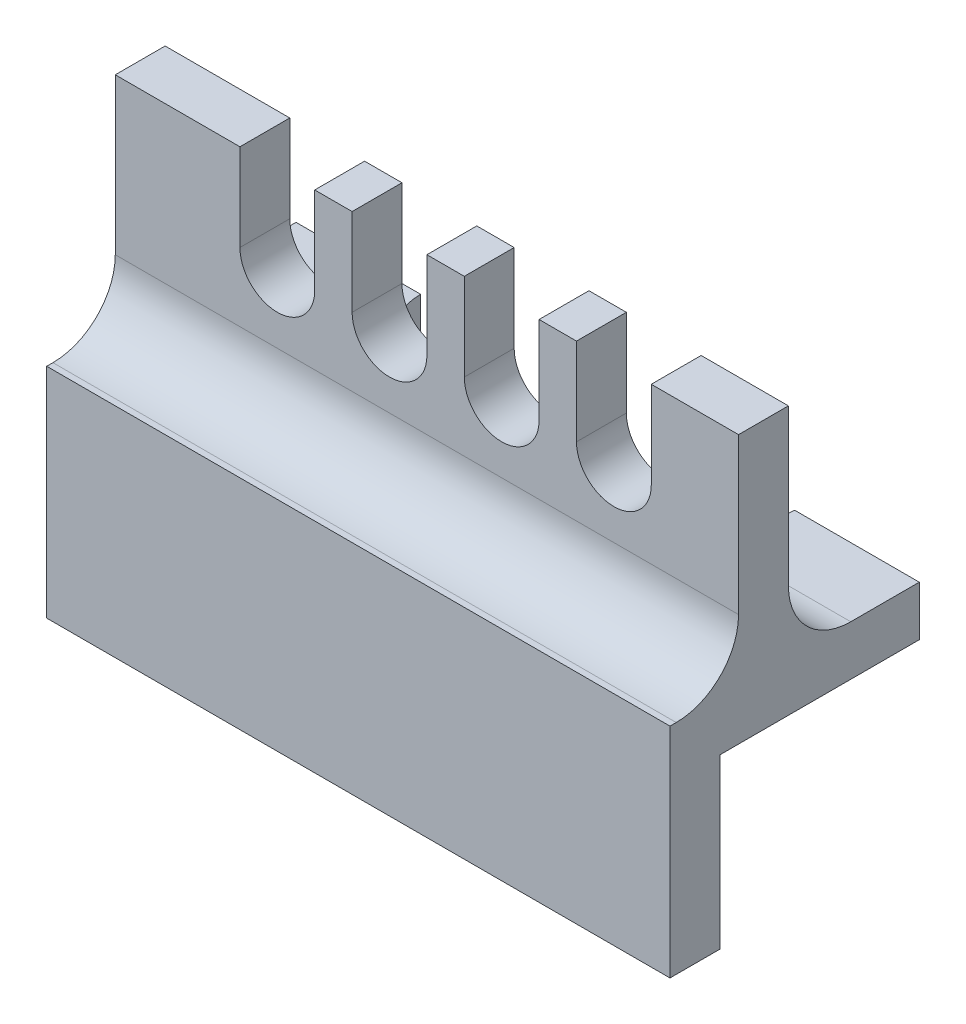
ISO-10303-21;
HEADER;
FILE_DESCRIPTION(('STEP AP214'),'2;1');
FILE_NAME('part.step','',(''),(''),'','','');
FILE_SCHEMA(('AUTOMOTIVE_DESIGN { 1 0 10303 214 1 1 1 1 }'));
ENDSEC;
DATA;
#1=APPLICATION_CONTEXT('core data for automotive mechanical design processes');
#2=APPLICATION_PROTOCOL_DEFINITION('international standard','automotive_design',2000,#1);
#3=PRODUCT_CONTEXT('',#1,'mechanical');
#4=PRODUCT('Part','Part','',(#3));
#5=PRODUCT_RELATED_PRODUCT_CATEGORY('part','',(#4));
#6=PRODUCT_DEFINITION_FORMATION('','',#4);
#7=PRODUCT_DEFINITION_CONTEXT('part definition',#1,'design');
#8=PRODUCT_DEFINITION('design','',#6,#7);
#9=PRODUCT_DEFINITION_SHAPE('','',#8);
#10=(LENGTH_UNIT() NAMED_UNIT(*) SI_UNIT(.MILLI.,.METRE.));
#11=(NAMED_UNIT(*) PLANE_ANGLE_UNIT() SI_UNIT($,.RADIAN.));
#12=(NAMED_UNIT(*) SI_UNIT($,.STERADIAN.) SOLID_ANGLE_UNIT());
#13=UNCERTAINTY_MEASURE_WITH_UNIT(LENGTH_MEASURE(1.E-05),#10,'distance_accuracy_value','');
#14=(GEOMETRIC_REPRESENTATION_CONTEXT(3) GLOBAL_UNCERTAINTY_ASSIGNED_CONTEXT((#13)) GLOBAL_UNIT_ASSIGNED_CONTEXT((#10,
#11,#12)) REPRESENTATION_CONTEXT('',''));
#15=CARTESIAN_POINT('',(0.,0.,0.));
#16=DIRECTION('',(0.,0.,1.));
#17=DIRECTION('',(1.,0.,0.));
#18=AXIS2_PLACEMENT_3D('',#15,#16,#17);
#19=CARTESIAN_POINT('',(-100.,70.,-11.));
#20=DIRECTION('',(0.,1.,0.));
#21=DIRECTION('',(0.,0.,1.));
#22=AXIS2_PLACEMENT_3D('',#19,#20,#21);
#23=PLANE('',#22);
#24=DIRECTION('',(0.,0.,-1.));
#25=VECTOR('',#24,1.);
#26=CARTESIAN_POINT('',(-26.,70.,-8.99999999999999));
#27=LINE('',#26,#25);
#28=CARTESIAN_POINT('',(-26.,70.,-11.));
#29=VERTEX_POINT('',#28);
#30=CARTESIAN_POINT('',(-26.,70.,-19.));
#31=VERTEX_POINT('',#30);
#32=EDGE_CURVE('E285',#29,#31,#27,.T.);
#33=ORIENTED_EDGE('',*,*,#32,.T.);
#34=DIRECTION('',(1.,0.,0.));
#35=VECTOR('',#34,1.);
#36=CARTESIAN_POINT('',(-100.,70.,-19.));
#37=LINE('',#36,#35);
#38=CARTESIAN_POINT('',(-32.,70.,-19.));
#39=VERTEX_POINT('',#38);
#40=EDGE_CURVE('E568',#39,#31,#37,.T.);
#41=ORIENTED_EDGE('',*,*,#40,.F.);
#42=DIRECTION('',(0.,0.,-1.));
#43=VECTOR('',#42,1.);
#44=CARTESIAN_POINT('',(-32.,70.,-8.99999999999999));
#45=LINE('',#44,#43);
#46=CARTESIAN_POINT('',(-32.,70.,-11.));
#47=VERTEX_POINT('',#46);
#48=EDGE_CURVE('E62',#47,#39,#45,.T.);
#49=ORIENTED_EDGE('',*,*,#48,.F.);
#50=DIRECTION('',(1.,0.,0.));
#51=VECTOR('',#50,1.);
#52=CARTESIAN_POINT('',(-100.,70.,-11.));
#53=LINE('',#52,#51);
#54=EDGE_CURVE('E533',#47,#29,#53,.T.);
#55=ORIENTED_EDGE('',*,*,#54,.T.);
#56=EDGE_LOOP('',(#33,#41,#49,#55));
#57=FACE_BOUND('',#56,.T.);
#58=ADVANCED_FACE('F39',(#57),#23,.T.);
#59=DIRECTION('',(0.,0.,-1.));
#60=VECTOR('',#59,1.);
#61=CARTESIAN_POINT('',(-62.,70.,-8.99999999999999));
#62=LINE('',#61,#60);
#63=CARTESIAN_POINT('',(-62.,70.,-11.));
#64=VERTEX_POINT('',#63);
#65=CARTESIAN_POINT('',(-62.,70.,-19.));
#66=VERTEX_POINT('',#65);
#67=EDGE_CURVE('E300',#64,#66,#62,.T.);
#68=ORIENTED_EDGE('',*,*,#67,.T.);
#69=CARTESIAN_POINT('',(-68.,70.,-19.));
#70=VERTEX_POINT('',#69);
#71=EDGE_CURVE('E432',#70,#66,#37,.T.);
#72=ORIENTED_EDGE('',*,*,#71,.F.);
#73=DIRECTION('',(0.,0.,-1.));
#74=VECTOR('',#73,1.);
#75=CARTESIAN_POINT('',(-68.,70.,-8.99999999999999));
#76=LINE('',#75,#74);
#77=CARTESIAN_POINT('',(-68.,70.,-11.));
#78=VERTEX_POINT('',#77);
#79=EDGE_CURVE('E320',#78,#70,#76,.T.);
#80=ORIENTED_EDGE('',*,*,#79,.F.);
#81=EDGE_CURVE('E427',#78,#64,#53,.T.);
#82=ORIENTED_EDGE('',*,*,#81,.T.);
#83=EDGE_LOOP('',(#68,#72,#80,#82));
#84=FACE_BOUND('',#83,.T.);
#85=ADVANCED_FACE('F546',(#84),#23,.T.);
#86=DIRECTION('',(0.,0.,-1.));
#87=VECTOR('',#86,1.);
#88=CARTESIAN_POINT('',(-50.,70.,-8.99999999999999));
#89=LINE('',#88,#87);
#90=CARTESIAN_POINT('',(-50.,70.,-11.));
#91=VERTEX_POINT('',#90);
#92=CARTESIAN_POINT('',(-50.,70.,-19.));
#93=VERTEX_POINT('',#92);
#94=EDGE_CURVE('E291',#91,#93,#89,.T.);
#95=ORIENTED_EDGE('',*,*,#94,.F.);
#96=CARTESIAN_POINT('',(-44.,70.,-11.));
#97=VERTEX_POINT('',#96);
#98=EDGE_CURVE('E535',#91,#97,#53,.T.);
#99=ORIENTED_EDGE('',*,*,#98,.T.);
#100=DIRECTION('',(0.,0.,-1.));
#101=VECTOR('',#100,1.);
#102=CARTESIAN_POINT('',(-44.,70.,-8.99999999999999));
#103=LINE('',#102,#101);
#104=CARTESIAN_POINT('',(-44.,70.,-19.));
#105=VERTEX_POINT('',#104);
#106=EDGE_CURVE('E314',#97,#105,#103,.T.);
#107=ORIENTED_EDGE('',*,*,#106,.T.);
#108=EDGE_CURVE('E567',#93,#105,#37,.T.);
#109=ORIENTED_EDGE('',*,*,#108,.F.);
#110=EDGE_LOOP('',(#95,#99,#107,#109));
#111=FACE_BOUND('',#110,.T.);
#112=ADVANCED_FACE('F608',(#111),#23,.T.);
#113=DIRECTION('',(0.,0.,-1.));
#114=VECTOR('',#113,1.);
#115=CARTESIAN_POINT('',(-80.,70.,-8.99999999999999));
#116=LINE('',#115,#114);
#117=CARTESIAN_POINT('',(-80.,70.,-11.));
#118=VERTEX_POINT('',#117);
#119=CARTESIAN_POINT('',(-80.,70.,-19.));
#120=VERTEX_POINT('',#119);
#121=EDGE_CURVE('E282',#118,#120,#116,.T.);
#122=ORIENTED_EDGE('',*,*,#121,.T.);
#123=CARTESIAN_POINT('',(-100.,70.,-19.));
#124=VERTEX_POINT('',#123);
#125=EDGE_CURVE('E429',#124,#120,#37,.T.);
#126=ORIENTED_EDGE('',*,*,#125,.F.);
#127=DIRECTION('',(0.,0.,1.));
#128=VECTOR('',#127,1.);
#129=CARTESIAN_POINT('',(-100.,70.,-11.));
#130=LINE('',#129,#128);
#131=CARTESIAN_POINT('',(-100.,70.,-11.));
#132=VERTEX_POINT('',#131);
#133=EDGE_CURVE('E379',#124,#132,#130,.T.);
#134=ORIENTED_EDGE('',*,*,#133,.T.);
#135=EDGE_CURVE('E424',#132,#118,#53,.T.);
#136=ORIENTED_EDGE('',*,*,#135,.T.);
#137=EDGE_LOOP('',(#122,#126,#134,#136));
#138=FACE_BOUND('',#137,.T.);
#139=ADVANCED_FACE('F581',(#138),#23,.T.);
#140=CARTESIAN_POINT('',(-100.,35.,-40.));
#141=DIRECTION('',(0.,0.,-1.));
#142=DIRECTION('',(0.,1.,0.));
#143=AXIS2_PLACEMENT_3D('',#140,#141,#142);
#144=PLANE('',#143);
#145=DIRECTION('',(0.,-1.,0.));
#146=VECTOR('',#145,1.);
#147=CARTESIAN_POINT('',(-20.,27.,-40.));
#148=LINE('',#147,#146);
#149=CARTESIAN_POINT('',(-20.,35.,-40.));
#150=VERTEX_POINT('',#149);
#151=CARTESIAN_POINT('',(-20.,27.,-40.));
#152=VERTEX_POINT('',#151);
#153=EDGE_CURVE('E348',#150,#152,#148,.T.);
#154=ORIENTED_EDGE('',*,*,#153,.F.);
#155=DIRECTION('',(1.,0.,0.));
#156=VECTOR('',#155,1.);
#157=CARTESIAN_POINT('',(-100.,35.,-40.));
#158=LINE('',#157,#156);
#159=CARTESIAN_POINT('',(0.,35.,-40.));
#160=VERTEX_POINT('',#159);
#161=EDGE_CURVE('E437',#150,#160,#158,.T.);
#162=ORIENTED_EDGE('',*,*,#161,.T.);
#163=DIRECTION('',(0.,1.,0.));
#164=VECTOR('',#163,1.);
#165=CARTESIAN_POINT('',(0.,35.,-40.));
#166=LINE('',#165,#164);
#167=CARTESIAN_POINT('',(0.,27.,-40.));
#168=VERTEX_POINT('',#167);
#169=EDGE_CURVE('E399',#168,#160,#166,.T.);
#170=ORIENTED_EDGE('',*,*,#169,.F.);
#171=DIRECTION('',(1.,0.,0.));
#172=VECTOR('',#171,1.);
#173=CARTESIAN_POINT('',(-100.,27.,-40.));
#174=LINE('',#173,#172);
#175=EDGE_CURVE('E441',#152,#168,#174,.T.);
#176=ORIENTED_EDGE('',*,*,#175,.F.);
#177=EDGE_LOOP('',(#154,#162,#170,#176));
#178=FACE_BOUND('',#177,.T.);
#179=ADVANCED_FACE('F495',(#178),#144,.T.);
#180=CARTESIAN_POINT('',(-100.,0.,-8.));
#181=DIRECTION('',(0.,-1.,0.));
#182=DIRECTION('',(0.,0.,-1.));
#183=AXIS2_PLACEMENT_3D('',#180,#181,#182);
#184=PLANE('',#183);
#185=DIRECTION('',(0.,0.,-1.));
#186=VECTOR('',#185,1.);
#187=CARTESIAN_POINT('',(0.,0.,-8.));
#188=LINE('',#187,#186);
#189=CARTESIAN_POINT('',(0.,0.,0.));
#190=VERTEX_POINT('',#189);
#191=CARTESIAN_POINT('',(0.,0.,-8.));
#192=VERTEX_POINT('',#191);
#193=EDGE_CURVE('E356',#190,#192,#188,.T.);
#194=ORIENTED_EDGE('',*,*,#193,.F.);
#195=DIRECTION('',(1.,0.,0.));
#196=VECTOR('',#195,1.);
#197=CARTESIAN_POINT('',(-100.,0.,0.));
#198=LINE('',#197,#196);
#199=CARTESIAN_POINT('',(-100.,0.,0.));
#200=VERTEX_POINT('',#199);
#201=EDGE_CURVE('E418',#200,#190,#198,.T.);
#202=ORIENTED_EDGE('',*,*,#201,.F.);
#203=DIRECTION('',(0.,0.,-1.));
#204=VECTOR('',#203,1.);
#205=CARTESIAN_POINT('',(-100.,0.,-8.));
#206=LINE('',#205,#204);
#207=CARTESIAN_POINT('',(-100.,0.,-8.));
#208=VERTEX_POINT('',#207);
#209=EDGE_CURVE('E361',#200,#208,#206,.T.);
#210=ORIENTED_EDGE('',*,*,#209,.T.);
#211=DIRECTION('',(1.,0.,0.));
#212=VECTOR('',#211,1.);
#213=CARTESIAN_POINT('',(-100.,0.,-8.));
#214=LINE('',#213,#212);
#215=EDGE_CURVE('E390',#208,#192,#214,.T.);
#216=ORIENTED_EDGE('',*,*,#215,.T.);
#217=EDGE_LOOP('',(#194,#202,#210,#216));
#218=FACE_BOUND('',#217,.T.);
#219=ADVANCED_FACE('F509',(#218),#184,.T.);
#220=CARTESIAN_POINT('',(-100.,0.,0.));
#221=DIRECTION('',(0.,0.,1.));
#222=DIRECTION('',(1.,0.,0.));
#223=AXIS2_PLACEMENT_3D('',#220,#221,#222);
#224=PLANE('',#223);
#225=DIRECTION('',(0.,-1.,0.));
#226=VECTOR('',#225,1.);
#227=CARTESIAN_POINT('',(0.,0.,0.));
#228=LINE('',#227,#226);
#229=CARTESIAN_POINT('',(0.,35.,0.));
#230=VERTEX_POINT('',#229);
#231=EDGE_CURVE('E365',#230,#190,#228,.T.);
#232=ORIENTED_EDGE('',*,*,#231,.F.);
#233=DIRECTION('',(1.,0.,0.));
#234=VECTOR('',#233,1.);
#235=CARTESIAN_POINT('',(-100.,35.,0.));
#236=LINE('',#235,#234);
#237=CARTESIAN_POINT('',(-100.,35.,0.));
#238=VERTEX_POINT('',#237);
#239=EDGE_CURVE('E421',#238,#230,#236,.T.);
#240=ORIENTED_EDGE('',*,*,#239,.F.);
#241=DIRECTION('',(0.,-1.,0.));
#242=VECTOR('',#241,1.);
#243=CARTESIAN_POINT('',(-100.,0.,0.));
#244=LINE('',#243,#242);
#245=EDGE_CURVE('E387',#238,#200,#244,.T.);
#246=ORIENTED_EDGE('',*,*,#245,.T.);
#247=ORIENTED_EDGE('',*,*,#201,.T.);
#248=EDGE_LOOP('',(#232,#240,#246,#247));
#249=FACE_BOUND('',#248,.T.);
#250=ADVANCED_FACE('F515',(#249),#224,.T.);
#251=CARTESIAN_POINT('',(-100.,35.,0.));
#252=DIRECTION('',(0.,1.,0.));
#253=DIRECTION('',(0.,0.,1.));
#254=AXIS2_PLACEMENT_3D('',#251,#252,#253);
#255=PLANE('',#254);
#256=DIRECTION('',(0.,0.,1.));
#257=VECTOR('',#256,1.);
#258=CARTESIAN_POINT('',(0.,35.,0.));
#259=LINE('',#258,#257);
#260=CARTESIAN_POINT('',(0.,35.,-0.999999999999992));
#261=VERTEX_POINT('',#260);
#262=EDGE_CURVE('E414',#261,#230,#259,.T.);
#263=ORIENTED_EDGE('',*,*,#262,.F.);
#264=DIRECTION('',(1.,0.,0.));
#265=VECTOR('',#264,1.);
#266=CARTESIAN_POINT('',(-100.,35.,-0.999999999999992));
#267=LINE('',#266,#265);
#268=CARTESIAN_POINT('',(-100.,35.,-0.999999999999992));
#269=VERTEX_POINT('',#268);
#270=EDGE_CURVE('E447',#261,#269,#267,.F.);
#271=ORIENTED_EDGE('',*,*,#270,.T.);
#272=DIRECTION('',(0.,0.,1.));
#273=VECTOR('',#272,1.);
#274=CARTESIAN_POINT('',(-100.,35.,0.));
#275=LINE('',#274,#273);
#276=EDGE_CURVE('E385',#269,#238,#275,.T.);
#277=ORIENTED_EDGE('',*,*,#276,.T.);
#278=ORIENTED_EDGE('',*,*,#239,.T.);
#279=EDGE_LOOP('',(#263,#271,#277,#278));
#280=FACE_BOUND('',#279,.T.);
#281=ADVANCED_FACE('F518',(#280),#255,.T.);
#282=CARTESIAN_POINT('',(-100.,35.,-11.));
#283=DIRECTION('',(0.,0.,1.));
#284=DIRECTION('',(1.,0.,0.));
#285=AXIS2_PLACEMENT_3D('',#282,#283,#284);
#286=PLANE('',#285);
#287=CARTESIAN_POINT('',(-20.,56.,-11.));
#288=DIRECTION('',(0.,0.,1.));
#289=DIRECTION('',(1.,0.,0.));
#290=AXIS2_PLACEMENT_3D('',#287,#288,#289);
#291=CIRCLE('',#290,6.);
#292=CARTESIAN_POINT('',(-26.,56.,-11.));
#293=VERTEX_POINT('',#292);
#294=CARTESIAN_POINT('',(-14.,56.,-11.));
#295=VERTEX_POINT('',#294);
#296=EDGE_CURVE('E262',#293,#295,#291,.T.);
#297=ORIENTED_EDGE('',*,*,#296,.F.);
#298=DIRECTION('',(0.,-1.,0.));
#299=VECTOR('',#298,1.);
#300=CARTESIAN_POINT('',(-26.,35.,-11.));
#301=LINE('',#300,#299);
#302=EDGE_CURVE('E346',#29,#293,#301,.T.);
#303=ORIENTED_EDGE('',*,*,#302,.F.);
#304=ORIENTED_EDGE('',*,*,#54,.F.);
#305=DIRECTION('',(0.,1.,0.));
#306=VECTOR('',#305,1.);
#307=CARTESIAN_POINT('',(-32.,35.,-11.));
#308=LINE('',#307,#306);
#309=CARTESIAN_POINT('',(-32.,56.,-11.));
#310=VERTEX_POINT('',#309);
#311=EDGE_CURVE('E336',#310,#47,#308,.T.);
#312=ORIENTED_EDGE('',*,*,#311,.F.);
#313=CARTESIAN_POINT('',(-38.,56.,-11.));
#314=DIRECTION('',(0.,0.,1.));
#315=DIRECTION('',(1.,0.,0.));
#316=AXIS2_PLACEMENT_3D('',#313,#314,#315);
#317=CIRCLE('',#316,6.);
#318=CARTESIAN_POINT('',(-44.,56.,-11.));
#319=VERTEX_POINT('',#318);
#320=EDGE_CURVE('E279',#319,#310,#317,.T.);
#321=ORIENTED_EDGE('',*,*,#320,.F.);
#322=DIRECTION('',(0.,-1.,0.));
#323=VECTOR('',#322,1.);
#324=CARTESIAN_POINT('',(-44.,35.,-11.));
#325=LINE('',#324,#323);
#326=EDGE_CURVE('E338',#97,#319,#325,.T.);
#327=ORIENTED_EDGE('',*,*,#326,.F.);
#328=ORIENTED_EDGE('',*,*,#98,.F.);
#329=DIRECTION('',(0.,1.,0.));
#330=VECTOR('',#329,1.);
#331=CARTESIAN_POINT('',(-50.,35.,-11.));
#332=LINE('',#331,#330);
#333=CARTESIAN_POINT('',(-50.,56.,-11.));
#334=VERTEX_POINT('',#333);
#335=EDGE_CURVE('E340',#334,#91,#332,.T.);
#336=ORIENTED_EDGE('',*,*,#335,.F.);
#337=CARTESIAN_POINT('',(-56.,56.,-11.));
#338=DIRECTION('',(0.,0.,1.));
#339=DIRECTION('',(1.,0.,0.));
#340=AXIS2_PLACEMENT_3D('',#337,#338,#339);
#341=CIRCLE('',#340,6.);
#342=CARTESIAN_POINT('',(-62.,56.,-11.));
#343=VERTEX_POINT('',#342);
#344=EDGE_CURVE('E270',#343,#334,#341,.T.);
#345=ORIENTED_EDGE('',*,*,#344,.F.);
#346=DIRECTION('',(0.,-1.,0.));
#347=VECTOR('',#346,1.);
#348=CARTESIAN_POINT('',(-62.,35.,-11.));
#349=LINE('',#348,#347);
#350=EDGE_CURVE('E342',#64,#343,#349,.T.);
#351=ORIENTED_EDGE('',*,*,#350,.F.);
#352=ORIENTED_EDGE('',*,*,#81,.F.);
#353=DIRECTION('',(0.,1.,0.));
#354=VECTOR('',#353,1.);
#355=CARTESIAN_POINT('',(-68.,35.,-11.));
#356=LINE('',#355,#354);
#357=CARTESIAN_POINT('',(-68.,56.,-11.));
#358=VERTEX_POINT('',#357);
#359=EDGE_CURVE('E288',#358,#78,#356,.T.);
#360=ORIENTED_EDGE('',*,*,#359,.F.);
#361=CARTESIAN_POINT('',(-74.,56.,-11.));
#362=DIRECTION('',(0.,0.,1.));
#363=DIRECTION('',(1.,0.,0.));
#364=AXIS2_PLACEMENT_3D('',#361,#362,#363);
#365=CIRCLE('',#364,5.99999999999998);
#366=CARTESIAN_POINT('',(-80.,56.,-11.));
#367=VERTEX_POINT('',#366);
#368=EDGE_CURVE('E281',#367,#358,#365,.T.);
#369=ORIENTED_EDGE('',*,*,#368,.F.);
#370=DIRECTION('',(0.,-1.,0.));
#371=VECTOR('',#370,1.);
#372=CARTESIAN_POINT('',(-80.,35.,-11.));
#373=LINE('',#372,#371);
#374=EDGE_CURVE('E334',#118,#367,#373,.T.);
#375=ORIENTED_EDGE('',*,*,#374,.F.);
#376=ORIENTED_EDGE('',*,*,#135,.F.);
#377=DIRECTION('',(0.,-1.,0.));
#378=VECTOR('',#377,1.);
#379=CARTESIAN_POINT('',(-100.,35.,-11.));
#380=LINE('',#379,#378);
#381=CARTESIAN_POINT('',(-100.,45.,-11.));
#382=VERTEX_POINT('',#381);
#383=EDGE_CURVE('E382',#132,#382,#380,.T.);
#384=ORIENTED_EDGE('',*,*,#383,.T.);
#385=DIRECTION('',(1.,0.,0.));
#386=VECTOR('',#385,1.);
#387=CARTESIAN_POINT('',(0.,45.,-11.));
#388=LINE('',#387,#386);
#389=CARTESIAN_POINT('',(0.,45.,-11.));
#390=VERTEX_POINT('',#389);
#391=EDGE_CURVE('E420',#382,#390,#388,.T.);
#392=ORIENTED_EDGE('',*,*,#391,.T.);
#393=DIRECTION('',(0.,-1.,0.));
#394=VECTOR('',#393,1.);
#395=CARTESIAN_POINT('',(0.,35.,-11.));
#396=LINE('',#395,#394);
#397=CARTESIAN_POINT('',(0.,70.,-11.));
#398=VERTEX_POINT('',#397);
#399=EDGE_CURVE('E411',#398,#390,#396,.T.);
#400=ORIENTED_EDGE('',*,*,#399,.F.);
#401=CARTESIAN_POINT('',(-14.,70.,-11.));
#402=VERTEX_POINT('',#401);
#403=EDGE_CURVE('E428',#402,#398,#53,.T.);
#404=ORIENTED_EDGE('',*,*,#403,.F.);
#405=DIRECTION('',(0.,1.,0.));
#406=VECTOR('',#405,1.);
#407=CARTESIAN_POINT('',(-14.,35.,-11.));
#408=LINE('',#407,#406);
#409=EDGE_CURVE('E344',#295,#402,#408,.T.);
#410=ORIENTED_EDGE('',*,*,#409,.F.);
#411=EDGE_LOOP('',(#297,#303,#304,#312,#321,#327,#328,#336,#345,#351,#352,#360,#369,#375,#376,
#384,#392,#400,#404,#410));
#412=FACE_BOUND('',#411,.T.);
#413=ADVANCED_FACE('F527',(#412),#286,.T.);
#414=DIRECTION('',(0.,0.,-1.));
#415=VECTOR('',#414,1.);
#416=CARTESIAN_POINT('',(-14.,70.,-8.99999999999999));
#417=LINE('',#416,#415);
#418=CARTESIAN_POINT('',(-14.,70.,-19.));
#419=VERTEX_POINT('',#418);
#420=EDGE_CURVE('E54',#402,#419,#417,.T.);
#421=ORIENTED_EDGE('',*,*,#420,.F.);
#422=ORIENTED_EDGE('',*,*,#403,.T.);
#423=DIRECTION('',(0.,0.,1.));
#424=VECTOR('',#423,1.);
#425=CARTESIAN_POINT('',(0.,70.,-11.));
#426=LINE('',#425,#424);
#427=CARTESIAN_POINT('',(0.,70.,-19.));
#428=VERTEX_POINT('',#427);
#429=EDGE_CURVE('E408',#428,#398,#426,.T.);
#430=ORIENTED_EDGE('',*,*,#429,.F.);
#431=EDGE_CURVE('E433',#419,#428,#37,.T.);
#432=ORIENTED_EDGE('',*,*,#431,.F.);
#433=EDGE_LOOP('',(#421,#422,#430,#432));
#434=FACE_BOUND('',#433,.T.);
#435=ADVANCED_FACE('F532',(#434),#23,.T.);
#436=CARTESIAN_POINT('',(-100.,70.,-19.));
#437=DIRECTION('',(0.,0.,-1.));
#438=DIRECTION('',(0.,1.,0.));
#439=AXIS2_PLACEMENT_3D('',#436,#437,#438);
#440=PLANE('',#439);
#441=CARTESIAN_POINT('',(-20.,56.,-19.));
#442=DIRECTION('',(0.,0.,-1.));
#443=DIRECTION('',(0.,1.,0.));
#444=AXIS2_PLACEMENT_3D('',#441,#442,#443);
#445=CIRCLE('',#444,6.);
#446=CARTESIAN_POINT('',(-14.,56.,-19.));
#447=VERTEX_POINT('',#446);
#448=CARTESIAN_POINT('',(-26.,56.,-19.));
#449=VERTEX_POINT('',#448);
#450=EDGE_CURVE('E259',#447,#449,#445,.T.);
#451=ORIENTED_EDGE('',*,*,#450,.F.);
#452=DIRECTION('',(0.,-1.,0.));
#453=VECTOR('',#452,1.);
#454=CARTESIAN_POINT('',(-14.,70.,-19.));
#455=LINE('',#454,#453);
#456=EDGE_CURVE('E245',#419,#447,#455,.T.);
#457=ORIENTED_EDGE('',*,*,#456,.F.);
#458=ORIENTED_EDGE('',*,*,#431,.T.);
#459=DIRECTION('',(0.,1.,0.));
#460=VECTOR('',#459,1.);
#461=CARTESIAN_POINT('',(0.,70.,-19.));
#462=LINE('',#461,#460);
#463=CARTESIAN_POINT('',(0.,45.,-19.));
#464=VERTEX_POINT('',#463);
#465=EDGE_CURVE('E405',#464,#428,#462,.T.);
#466=ORIENTED_EDGE('',*,*,#465,.F.);
#467=DIRECTION('',(1.,0.,0.));
#468=VECTOR('',#467,1.);
#469=CARTESIAN_POINT('',(-100.,45.,-19.));
#470=LINE('',#469,#468);
#471=CARTESIAN_POINT('',(-100.,45.,-19.));
#472=VERTEX_POINT('',#471);
#473=EDGE_CURVE('E452',#464,#472,#470,.F.);
#474=ORIENTED_EDGE('',*,*,#473,.T.);
#475=DIRECTION('',(0.,1.,0.));
#476=VECTOR('',#475,1.);
#477=CARTESIAN_POINT('',(-100.,70.,-19.));
#478=LINE('',#477,#476);
#479=EDGE_CURVE('E377',#472,#124,#478,.T.);
#480=ORIENTED_EDGE('',*,*,#479,.T.);
#481=ORIENTED_EDGE('',*,*,#125,.T.);
#482=DIRECTION('',(0.,1.,0.));
#483=VECTOR('',#482,1.);
#484=CARTESIAN_POINT('',(-80.,56.,-19.));
#485=LINE('',#484,#483);
#486=CARTESIAN_POINT('',(-80.,56.,-19.));
#487=VERTEX_POINT('',#486);
#488=EDGE_CURVE('E322',#487,#120,#485,.T.);
#489=ORIENTED_EDGE('',*,*,#488,.F.);
#490=CARTESIAN_POINT('',(-74.,56.,-19.));
#491=DIRECTION('',(0.,0.,-1.));
#492=DIRECTION('',(0.,-1.,0.));
#493=AXIS2_PLACEMENT_3D('',#490,#491,#492);
#494=CIRCLE('',#493,5.99999999999998);
#495=CARTESIAN_POINT('',(-68.,56.,-19.));
#496=VERTEX_POINT('',#495);
#497=EDGE_CURVE('E276',#496,#487,#494,.T.);
#498=ORIENTED_EDGE('',*,*,#497,.F.);
#499=DIRECTION('',(0.,-1.,0.));
#500=VECTOR('',#499,1.);
#501=CARTESIAN_POINT('',(-68.,70.,-19.));
#502=LINE('',#501,#500);
#503=EDGE_CURVE('E317',#70,#496,#502,.T.);
#504=ORIENTED_EDGE('',*,*,#503,.F.);
#505=ORIENTED_EDGE('',*,*,#71,.T.);
#506=DIRECTION('',(0.,1.,0.));
#507=VECTOR('',#506,1.);
#508=CARTESIAN_POINT('',(-62.,56.,-19.));
#509=LINE('',#508,#507);
#510=CARTESIAN_POINT('',(-62.,56.,-19.));
#511=VERTEX_POINT('',#510);
#512=EDGE_CURVE('E293',#511,#66,#509,.T.);
#513=ORIENTED_EDGE('',*,*,#512,.F.);
#514=CARTESIAN_POINT('',(-56.,56.,-19.));
#515=DIRECTION('',(0.,0.,-1.));
#516=DIRECTION('',(0.,-1.,0.));
#517=AXIS2_PLACEMENT_3D('',#514,#515,#516);
#518=CIRCLE('',#517,6.);
#519=CARTESIAN_POINT('',(-50.,56.,-19.));
#520=VERTEX_POINT('',#519);
#521=EDGE_CURVE('E272',#520,#511,#518,.T.);
#522=ORIENTED_EDGE('',*,*,#521,.F.);
#523=DIRECTION('',(0.,-1.,0.));
#524=VECTOR('',#523,1.);
#525=CARTESIAN_POINT('',(-50.,70.,-19.));
#526=LINE('',#525,#524);
#527=EDGE_CURVE('E254',#93,#520,#526,.T.);
#528=ORIENTED_EDGE('',*,*,#527,.F.);
#529=ORIENTED_EDGE('',*,*,#108,.T.);
#530=DIRECTION('',(0.,1.,0.));
#531=VECTOR('',#530,1.);
#532=CARTESIAN_POINT('',(-44.,56.,-19.));
#533=LINE('',#532,#531);
#534=CARTESIAN_POINT('',(-44.,56.,-19.));
#535=VERTEX_POINT('',#534);
#536=EDGE_CURVE('E307',#535,#105,#533,.T.);
#537=ORIENTED_EDGE('',*,*,#536,.F.);
#538=CARTESIAN_POINT('',(-38.,56.,-19.));
#539=DIRECTION('',(0.,0.,-1.));
#540=DIRECTION('',(0.,-1.,0.));
#541=AXIS2_PLACEMENT_3D('',#538,#539,#540);
#542=CIRCLE('',#541,6.);
#543=CARTESIAN_POINT('',(-32.,56.,-19.));
#544=VERTEX_POINT('',#543);
#545=EDGE_CURVE('E268',#544,#535,#542,.T.);
#546=ORIENTED_EDGE('',*,*,#545,.F.);
#547=DIRECTION('',(0.,-1.,0.));
#548=VECTOR('',#547,1.);
#549=CARTESIAN_POINT('',(-32.,70.,-19.));
#550=LINE('',#549,#548);
#551=EDGE_CURVE('E303',#39,#544,#550,.T.);
#552=ORIENTED_EDGE('',*,*,#551,.F.);
#553=ORIENTED_EDGE('',*,*,#40,.T.);
#554=DIRECTION('',(0.,1.,0.));
#555=VECTOR('',#554,1.);
#556=CARTESIAN_POINT('',(-26.,56.,-19.));
#557=LINE('',#556,#555);
#558=EDGE_CURVE('E253',#449,#31,#557,.T.);
#559=ORIENTED_EDGE('',*,*,#558,.F.);
#560=EDGE_LOOP('',(#451,#457,#458,#466,#474,#480,#481,#489,#498,#504,#505,#513,#522,#528,#529,
#537,#546,#552,#553,#559));
#561=FACE_BOUND('',#560,.T.);
#562=ADVANCED_FACE('F266',(#561),#440,.T.);
#563=CARTESIAN_POINT('',(-100.,35.,-19.));
#564=DIRECTION('',(0.,1.,0.));
#565=DIRECTION('',(0.,0.,1.));
#566=AXIS2_PLACEMENT_3D('',#563,#564,#565);
#567=PLANE('',#566);
#568=ORIENTED_EDGE('',*,*,#161,.F.);
#569=CARTESIAN_POINT('',(-30.,35.,-40.));
#570=DIRECTION('',(0.,1.,0.));
#571=DIRECTION('',(0.,0.,1.));
#572=AXIS2_PLACEMENT_3D('',#569,#570,#571);
#573=CIRCLE('',#572,10.);
#574=CARTESIAN_POINT('',(-30.,35.,-30.));
#575=VERTEX_POINT('',#574);
#576=EDGE_CURVE('E470',#150,#575,#573,.F.);
#577=ORIENTED_EDGE('',*,*,#576,.T.);
#578=DIRECTION('',(1.,0.,0.));
#579=VECTOR('',#578,1.);
#580=CARTESIAN_POINT('',(-20.,35.,-30.));
#581=LINE('',#580,#579);
#582=CARTESIAN_POINT('',(-70.,35.,-30.));
#583=VERTEX_POINT('',#582);
#584=EDGE_CURVE('E352',#583,#575,#581,.T.);
#585=ORIENTED_EDGE('',*,*,#584,.F.);
#586=CARTESIAN_POINT('',(-70.,35.,-40.));
#587=DIRECTION('',(0.,1.,0.));
#588=DIRECTION('',(0.,0.,1.));
#589=AXIS2_PLACEMENT_3D('',#586,#587,#588);
#590=CIRCLE('',#589,10.);
#591=CARTESIAN_POINT('',(-80.,35.,-40.));
#592=VERTEX_POINT('',#591);
#593=EDGE_CURVE('E47',#583,#592,#590,.F.);
#594=ORIENTED_EDGE('',*,*,#593,.T.);
#595=CARTESIAN_POINT('',(-100.,35.,-40.));
#596=VERTEX_POINT('',#595);
#597=EDGE_CURVE('E434',#596,#592,#158,.T.);
#598=ORIENTED_EDGE('',*,*,#597,.F.);
#599=DIRECTION('',(0.,0.,1.));
#600=VECTOR('',#599,1.);
#601=CARTESIAN_POINT('',(-100.,35.,-19.));
#602=LINE('',#601,#600);
#603=CARTESIAN_POINT('',(-100.,35.,-29.));
#604=VERTEX_POINT('',#603);
#605=EDGE_CURVE('E374',#596,#604,#602,.T.);
#606=ORIENTED_EDGE('',*,*,#605,.T.);
#607=DIRECTION('',(1.,0.,0.));
#608=VECTOR('',#607,1.);
#609=CARTESIAN_POINT('',(0.,35.,-29.));
#610=LINE('',#609,#608);
#611=CARTESIAN_POINT('',(0.,35.,-29.));
#612=VERTEX_POINT('',#611);
#613=EDGE_CURVE('E449',#604,#612,#610,.T.);
#614=ORIENTED_EDGE('',*,*,#613,.T.);
#615=DIRECTION('',(0.,0.,1.));
#616=VECTOR('',#615,1.);
#617=CARTESIAN_POINT('',(0.,35.,-19.));
#618=LINE('',#617,#616);
#619=EDGE_CURVE('E402',#160,#612,#618,.T.);
#620=ORIENTED_EDGE('',*,*,#619,.F.);
#621=EDGE_LOOP('',(#568,#577,#585,#594,#598,#606,#614,#620));
#622=FACE_BOUND('',#621,.T.);
#623=ADVANCED_FACE('F474',(#622),#567,.T.);
#624=DIRECTION('',(0.,1.,0.));
#625=VECTOR('',#624,1.);
#626=CARTESIAN_POINT('',(-80.,35.,-40.));
#627=LINE('',#626,#625);
#628=CARTESIAN_POINT('',(-80.,27.,-40.));
#629=VERTEX_POINT('',#628);
#630=EDGE_CURVE('E353',#629,#592,#627,.T.);
#631=ORIENTED_EDGE('',*,*,#630,.F.);
#632=CARTESIAN_POINT('',(-100.,27.,-40.));
#633=VERTEX_POINT('',#632);
#634=EDGE_CURVE('E438',#633,#629,#174,.T.);
#635=ORIENTED_EDGE('',*,*,#634,.F.);
#636=DIRECTION('',(0.,1.,0.));
#637=VECTOR('',#636,1.);
#638=CARTESIAN_POINT('',(-100.,35.,-40.));
#639=LINE('',#638,#637);
#640=EDGE_CURVE('E371',#633,#596,#639,.T.);
#641=ORIENTED_EDGE('',*,*,#640,.T.);
#642=ORIENTED_EDGE('',*,*,#597,.T.);
#643=EDGE_LOOP('',(#631,#635,#641,#642));
#644=FACE_BOUND('',#643,.T.);
#645=ADVANCED_FACE('F479',(#644),#144,.T.);
#646=CARTESIAN_POINT('',(-100.,27.,-40.));
#647=DIRECTION('',(0.,-1.,0.));
#648=DIRECTION('',(0.,0.,-1.));
#649=AXIS2_PLACEMENT_3D('',#646,#647,#648);
#650=PLANE('',#649);
#651=DIRECTION('',(-1.,0.,0.));
#652=VECTOR('',#651,1.);
#653=CARTESIAN_POINT('',(-80.,27.,-30.));
#654=LINE('',#653,#652);
#655=CARTESIAN_POINT('',(-30.,27.,-30.));
#656=VERTEX_POINT('',#655);
#657=CARTESIAN_POINT('',(-70.,27.,-30.));
#658=VERTEX_POINT('',#657);
#659=EDGE_CURVE('E349',#656,#658,#654,.T.);
#660=ORIENTED_EDGE('',*,*,#659,.F.);
#661=CARTESIAN_POINT('',(-30.,27.,-40.));
#662=DIRECTION('',(0.,-1.,0.));
#663=DIRECTION('',(0.,0.,-1.));
#664=AXIS2_PLACEMENT_3D('',#661,#662,#663);
#665=CIRCLE('',#664,10.);
#666=EDGE_CURVE('E468',#656,#152,#665,.F.);
#667=ORIENTED_EDGE('',*,*,#666,.T.);
#668=ORIENTED_EDGE('',*,*,#175,.T.);
#669=DIRECTION('',(0.,0.,-1.));
#670=VECTOR('',#669,1.);
#671=CARTESIAN_POINT('',(0.,27.,-40.));
#672=LINE('',#671,#670);
#673=CARTESIAN_POINT('',(0.,27.,-7.99999999999999));
#674=VERTEX_POINT('',#673);
#675=EDGE_CURVE('E396',#674,#168,#672,.T.);
#676=ORIENTED_EDGE('',*,*,#675,.F.);
#677=DIRECTION('',(1.,0.,0.));
#678=VECTOR('',#677,1.);
#679=CARTESIAN_POINT('',(-100.,27.,-7.99999999999999));
#680=LINE('',#679,#678);
#681=CARTESIAN_POINT('',(-100.,27.,-7.99999999999999));
#682=VERTEX_POINT('',#681);
#683=EDGE_CURVE('E442',#682,#674,#680,.T.);
#684=ORIENTED_EDGE('',*,*,#683,.F.);
#685=DIRECTION('',(0.,0.,-1.));
#686=VECTOR('',#685,1.);
#687=CARTESIAN_POINT('',(-100.,27.,-40.));
#688=LINE('',#687,#686);
#689=EDGE_CURVE('E368',#682,#633,#688,.T.);
#690=ORIENTED_EDGE('',*,*,#689,.T.);
#691=ORIENTED_EDGE('',*,*,#634,.T.);
#692=CARTESIAN_POINT('',(-70.,27.,-40.));
#693=DIRECTION('',(0.,-1.,0.));
#694=DIRECTION('',(0.,0.,-1.));
#695=AXIS2_PLACEMENT_3D('',#692,#693,#694);
#696=CIRCLE('',#695,10.);
#697=EDGE_CURVE('E11',#629,#658,#696,.F.);
#698=ORIENTED_EDGE('',*,*,#697,.T.);
#699=EDGE_LOOP('',(#660,#667,#668,#676,#684,#690,#691,#698));
#700=FACE_BOUND('',#699,.T.);
#701=ADVANCED_FACE('F484',(#700),#650,.T.);
#702=CARTESIAN_POINT('',(-100.,27.,-7.99999999999999));
#703=DIRECTION('',(0.,0.,-1.));
#704=DIRECTION('',(0.,1.,0.));
#705=AXIS2_PLACEMENT_3D('',#702,#703,#704);
#706=PLANE('',#705);
#707=DIRECTION('',(0.,1.,0.));
#708=VECTOR('',#707,1.);
#709=CARTESIAN_POINT('',(0.,27.,-7.99999999999999));
#710=LINE('',#709,#708);
#711=EDGE_CURVE('E393',#192,#674,#710,.T.);
#712=ORIENTED_EDGE('',*,*,#711,.F.);
#713=ORIENTED_EDGE('',*,*,#215,.F.);
#714=DIRECTION('',(0.,1.,0.));
#715=VECTOR('',#714,1.);
#716=CARTESIAN_POINT('',(-100.,27.,-7.99999999999999));
#717=LINE('',#716,#715);
#718=EDGE_CURVE('E364',#208,#682,#717,.T.);
#719=ORIENTED_EDGE('',*,*,#718,.T.);
#720=ORIENTED_EDGE('',*,*,#683,.T.);
#721=EDGE_LOOP('',(#712,#713,#719,#720));
#722=FACE_BOUND('',#721,.T.);
#723=ADVANCED_FACE('F506',(#722),#706,.T.);
#724=CARTESIAN_POINT('',(-100.,0.,0.));
#725=DIRECTION('',(-1.,0.,0.));
#726=DIRECTION('',(0.,0.,1.));
#727=AXIS2_PLACEMENT_3D('',#724,#725,#726);
#728=PLANE('',#727);
#729=ORIENTED_EDGE('',*,*,#209,.F.);
#730=ORIENTED_EDGE('',*,*,#245,.F.);
#731=ORIENTED_EDGE('',*,*,#276,.F.);
#732=CARTESIAN_POINT('',(-100.,45.,-0.999999999999992));
#733=DIRECTION('',(-1.,0.,0.));
#734=DIRECTION('',(0.,0.,1.));
#735=AXIS2_PLACEMENT_3D('',#732,#733,#734);
#736=CIRCLE('',#735,10.);
#737=EDGE_CURVE('E456',#269,#382,#736,.F.);
#738=ORIENTED_EDGE('',*,*,#737,.T.);
#739=ORIENTED_EDGE('',*,*,#383,.F.);
#740=ORIENTED_EDGE('',*,*,#133,.F.);
#741=ORIENTED_EDGE('',*,*,#479,.F.);
#742=CARTESIAN_POINT('',(-100.,45.,-29.));
#743=DIRECTION('',(-1.,0.,0.));
#744=DIRECTION('',(0.,0.,1.));
#745=AXIS2_PLACEMENT_3D('',#742,#743,#744);
#746=CIRCLE('',#745,10.);
#747=EDGE_CURVE('E460',#472,#604,#746,.F.);
#748=ORIENTED_EDGE('',*,*,#747,.T.);
#749=ORIENTED_EDGE('',*,*,#605,.F.);
#750=ORIENTED_EDGE('',*,*,#640,.F.);
#751=ORIENTED_EDGE('',*,*,#689,.F.);
#752=ORIENTED_EDGE('',*,*,#718,.F.);
#753=EDGE_LOOP('',(#729,#730,#731,#738,#739,#740,#741,#748,#749,#750,#751,#752));
#754=FACE_BOUND('',#753,.T.);
#755=ADVANCED_FACE('F505',(#754),#728,.T.);
#756=CARTESIAN_POINT('',(0.,0.,0.));
#757=DIRECTION('',(-1.,0.,0.));
#758=DIRECTION('',(0.,0.,1.));
#759=AXIS2_PLACEMENT_3D('',#756,#757,#758);
#760=PLANE('',#759);
#761=ORIENTED_EDGE('',*,*,#193,.T.);
#762=ORIENTED_EDGE('',*,*,#711,.T.);
#763=ORIENTED_EDGE('',*,*,#675,.T.);
#764=ORIENTED_EDGE('',*,*,#169,.T.);
#765=ORIENTED_EDGE('',*,*,#619,.T.);
#766=CARTESIAN_POINT('',(0.,45.,-29.));
#767=DIRECTION('',(-1.,0.,0.));
#768=DIRECTION('',(0.,0.,1.));
#769=AXIS2_PLACEMENT_3D('',#766,#767,#768);
#770=CIRCLE('',#769,10.);
#771=EDGE_CURVE('E458',#612,#464,#770,.T.);
#772=ORIENTED_EDGE('',*,*,#771,.T.);
#773=ORIENTED_EDGE('',*,*,#465,.T.);
#774=ORIENTED_EDGE('',*,*,#429,.T.);
#775=ORIENTED_EDGE('',*,*,#399,.T.);
#776=CARTESIAN_POINT('',(0.,45.,-0.999999999999992));
#777=DIRECTION('',(-1.,0.,0.));
#778=DIRECTION('',(0.,0.,1.));
#779=AXIS2_PLACEMENT_3D('',#776,#777,#778);
#780=CIRCLE('',#779,10.);
#781=EDGE_CURVE('E454',#390,#261,#780,.T.);
#782=ORIENTED_EDGE('',*,*,#781,.T.);
#783=ORIENTED_EDGE('',*,*,#262,.T.);
#784=ORIENTED_EDGE('',*,*,#231,.T.);
#785=EDGE_LOOP('',(#761,#762,#763,#764,#765,#772,#773,#774,#775,#782,#783,#784));
#786=FACE_BOUND('',#785,.T.);
#787=ADVANCED_FACE('F498',(#786),#760,.F.);
#788=CARTESIAN_POINT('',(-100.,45.,-0.999999999999992));
#789=DIRECTION('',(-1.,0.,0.));
#790=DIRECTION('',(0.,0.,1.));
#791=AXIS2_PLACEMENT_3D('',#788,#789,#790);
#792=CYLINDRICAL_SURFACE('',#791,10.);
#793=ORIENTED_EDGE('',*,*,#737,.F.);
#794=ORIENTED_EDGE('',*,*,#270,.F.);
#795=ORIENTED_EDGE('',*,*,#781,.F.);
#796=ORIENTED_EDGE('',*,*,#391,.F.);
#797=EDGE_LOOP('',(#793,#794,#795,#796));
#798=FACE_BOUND('',#797,.T.);
#799=ADVANCED_FACE('F524',(#798),#792,.F.);
#800=CARTESIAN_POINT('',(-100.,45.,-29.));
#801=DIRECTION('',(-1.,0.,0.));
#802=DIRECTION('',(0.,0.,1.));
#803=AXIS2_PLACEMENT_3D('',#800,#801,#802);
#804=CYLINDRICAL_SURFACE('',#803,10.);
#805=ORIENTED_EDGE('',*,*,#747,.F.);
#806=ORIENTED_EDGE('',*,*,#473,.F.);
#807=ORIENTED_EDGE('',*,*,#771,.F.);
#808=ORIENTED_EDGE('',*,*,#613,.F.);
#809=EDGE_LOOP('',(#805,#806,#807,#808));
#810=FACE_BOUND('',#809,.T.);
#811=ADVANCED_FACE('F575',(#810),#804,.F.);
#812=CARTESIAN_POINT('',(0.,0.,-30.));
#813=DIRECTION('',(0.,0.,1.));
#814=DIRECTION('',(0.,-1.,0.));
#815=AXIS2_PLACEMENT_3D('',#812,#813,#814);
#816=PLANE('',#815);
#817=ORIENTED_EDGE('',*,*,#584,.T.);
#818=DIRECTION('',(0.,-1.,0.));
#819=VECTOR('',#818,1.);
#820=CARTESIAN_POINT('',(-30.,27.,-30.));
#821=LINE('',#820,#819);
#822=EDGE_CURVE('E465',#575,#656,#821,.T.);
#823=ORIENTED_EDGE('',*,*,#822,.T.);
#824=ORIENTED_EDGE('',*,*,#659,.T.);
#825=DIRECTION('',(0.,1.,0.));
#826=VECTOR('',#825,1.);
#827=CARTESIAN_POINT('',(-70.,35.,-30.));
#828=LINE('',#827,#826);
#829=EDGE_CURVE('E462',#658,#583,#828,.T.);
#830=ORIENTED_EDGE('',*,*,#829,.T.);
#831=EDGE_LOOP('',(#817,#823,#824,#830));
#832=FACE_BOUND('',#831,.T.);
#833=ADVANCED_FACE('F486',(#832),#816,.F.);
#834=CARTESIAN_POINT('',(-30.,0.,-40.));
#835=DIRECTION('',(0.,1.,0.));
#836=DIRECTION('',(0.,0.,1.));
#837=AXIS2_PLACEMENT_3D('',#834,#835,#836);
#838=CYLINDRICAL_SURFACE('',#837,10.);
#839=ORIENTED_EDGE('',*,*,#576,.F.);
#840=ORIENTED_EDGE('',*,*,#153,.T.);
#841=ORIENTED_EDGE('',*,*,#666,.F.);
#842=ORIENTED_EDGE('',*,*,#822,.F.);
#843=EDGE_LOOP('',(#839,#840,#841,#842));
#844=FACE_BOUND('',#843,.T.);
#845=ADVANCED_FACE('F490',(#844),#838,.F.);
#846=CARTESIAN_POINT('',(-70.,0.,-40.));
#847=DIRECTION('',(0.,-1.,0.));
#848=DIRECTION('',(0.,0.,-1.));
#849=AXIS2_PLACEMENT_3D('',#846,#847,#848);
#850=CYLINDRICAL_SURFACE('',#849,10.);
#851=ORIENTED_EDGE('',*,*,#697,.F.);
#852=ORIENTED_EDGE('',*,*,#630,.T.);
#853=ORIENTED_EDGE('',*,*,#593,.F.);
#854=ORIENTED_EDGE('',*,*,#829,.F.);
#855=EDGE_LOOP('',(#851,#852,#853,#854));
#856=FACE_BOUND('',#855,.T.);
#857=ADVANCED_FACE('F41',(#856),#850,.F.);
#858=CARTESIAN_POINT('',(-80.,56.,-8.99999999999999));
#859=DIRECTION('',(-1.,0.,0.));
#860=DIRECTION('',(0.,0.,1.));
#861=AXIS2_PLACEMENT_3D('',#858,#859,#860);
#862=PLANE('',#861);
#863=ORIENTED_EDGE('',*,*,#374,.T.);
#864=DIRECTION('',(0.,0.,-1.));
#865=VECTOR('',#864,1.);
#866=CARTESIAN_POINT('',(-80.,56.,-8.99999999999999));
#867=LINE('',#866,#865);
#868=EDGE_CURVE('E326',#367,#487,#867,.T.);
#869=ORIENTED_EDGE('',*,*,#868,.T.);
#870=ORIENTED_EDGE('',*,*,#488,.T.);
#871=ORIENTED_EDGE('',*,*,#121,.F.);
#872=EDGE_LOOP('',(#863,#869,#870,#871));
#873=FACE_BOUND('',#872,.T.);
#874=ADVANCED_FACE('F584',(#873),#862,.F.);
#875=CARTESIAN_POINT('',(-68.,70.,-8.99999999999999));
#876=DIRECTION('',(1.,0.,0.));
#877=DIRECTION('',(0.,0.,-1.));
#878=AXIS2_PLACEMENT_3D('',#875,#876,#877);
#879=PLANE('',#878);
#880=ORIENTED_EDGE('',*,*,#503,.T.);
#881=DIRECTION('',(0.,0.,-1.));
#882=VECTOR('',#881,1.);
#883=CARTESIAN_POINT('',(-68.,56.,-8.99999999999999));
#884=LINE('',#883,#882);
#885=EDGE_CURVE('E323',#358,#496,#884,.T.);
#886=ORIENTED_EDGE('',*,*,#885,.F.);
#887=ORIENTED_EDGE('',*,*,#359,.T.);
#888=ORIENTED_EDGE('',*,*,#79,.T.);
#889=EDGE_LOOP('',(#880,#886,#887,#888));
#890=FACE_BOUND('',#889,.T.);
#891=ADVANCED_FACE('F590',(#890),#879,.F.);
#892=CARTESIAN_POINT('',(-44.,56.,-8.99999999999999));
#893=DIRECTION('',(-1.,0.,0.));
#894=DIRECTION('',(0.,0.,1.));
#895=AXIS2_PLACEMENT_3D('',#892,#893,#894);
#896=PLANE('',#895);
#897=ORIENTED_EDGE('',*,*,#326,.T.);
#898=DIRECTION('',(0.,0.,-1.));
#899=VECTOR('',#898,1.);
#900=CARTESIAN_POINT('',(-44.,56.,-8.99999999999999));
#901=LINE('',#900,#899);
#902=EDGE_CURVE('E311',#319,#535,#901,.T.);
#903=ORIENTED_EDGE('',*,*,#902,.T.);
#904=ORIENTED_EDGE('',*,*,#536,.T.);
#905=ORIENTED_EDGE('',*,*,#106,.F.);
#906=EDGE_LOOP('',(#897,#903,#904,#905));
#907=FACE_BOUND('',#906,.T.);
#908=ADVANCED_FACE('F592',(#907),#896,.F.);
#909=CARTESIAN_POINT('',(-32.,70.,-8.99999999999999));
#910=DIRECTION('',(1.,0.,0.));
#911=DIRECTION('',(0.,0.,-1.));
#912=AXIS2_PLACEMENT_3D('',#909,#910,#911);
#913=PLANE('',#912);
#914=ORIENTED_EDGE('',*,*,#551,.T.);
#915=DIRECTION('',(0.,0.,-1.));
#916=VECTOR('',#915,1.);
#917=CARTESIAN_POINT('',(-32.,56.,-8.99999999999999));
#918=LINE('',#917,#916);
#919=EDGE_CURVE('E308',#310,#544,#918,.T.);
#920=ORIENTED_EDGE('',*,*,#919,.F.);
#921=ORIENTED_EDGE('',*,*,#311,.T.);
#922=ORIENTED_EDGE('',*,*,#48,.T.);
#923=EDGE_LOOP('',(#914,#920,#921,#922));
#924=FACE_BOUND('',#923,.T.);
#925=ADVANCED_FACE('F598',(#924),#913,.F.);
#926=CARTESIAN_POINT('',(-62.,56.,-8.99999999999999));
#927=DIRECTION('',(-1.,0.,0.));
#928=DIRECTION('',(0.,0.,1.));
#929=AXIS2_PLACEMENT_3D('',#926,#927,#928);
#930=PLANE('',#929);
#931=ORIENTED_EDGE('',*,*,#350,.T.);
#932=DIRECTION('',(0.,0.,-1.));
#933=VECTOR('',#932,1.);
#934=CARTESIAN_POINT('',(-62.,56.,-8.99999999999999));
#935=LINE('',#934,#933);
#936=EDGE_CURVE('E297',#343,#511,#935,.T.);
#937=ORIENTED_EDGE('',*,*,#936,.T.);
#938=ORIENTED_EDGE('',*,*,#512,.T.);
#939=ORIENTED_EDGE('',*,*,#67,.F.);
#940=EDGE_LOOP('',(#931,#937,#938,#939));
#941=FACE_BOUND('',#940,.T.);
#942=ADVANCED_FACE('F556',(#941),#930,.F.);
#943=CARTESIAN_POINT('',(-50.,70.,-8.99999999999999));
#944=DIRECTION('',(1.,0.,0.));
#945=DIRECTION('',(0.,0.,-1.));
#946=AXIS2_PLACEMENT_3D('',#943,#944,#945);
#947=PLANE('',#946);
#948=ORIENTED_EDGE('',*,*,#527,.T.);
#949=DIRECTION('',(0.,0.,-1.));
#950=VECTOR('',#949,1.);
#951=CARTESIAN_POINT('',(-50.,56.,-8.99999999999999));
#952=LINE('',#951,#950);
#953=EDGE_CURVE('E294',#334,#520,#952,.T.);
#954=ORIENTED_EDGE('',*,*,#953,.F.);
#955=ORIENTED_EDGE('',*,*,#335,.T.);
#956=ORIENTED_EDGE('',*,*,#94,.T.);
#957=EDGE_LOOP('',(#948,#954,#955,#956));
#958=FACE_BOUND('',#957,.T.);
#959=ADVANCED_FACE('F641',(#958),#947,.F.);
#960=CARTESIAN_POINT('',(-26.,56.,-8.99999999999999));
#961=DIRECTION('',(-1.,0.,0.));
#962=DIRECTION('',(0.,0.,1.));
#963=AXIS2_PLACEMENT_3D('',#960,#961,#962);
#964=PLANE('',#963);
#965=ORIENTED_EDGE('',*,*,#302,.T.);
#966=DIRECTION('',(0.,0.,-1.));
#967=VECTOR('',#966,1.);
#968=CARTESIAN_POINT('',(-26.,56.,-8.99999999999999));
#969=LINE('',#968,#967);
#970=EDGE_CURVE('E263',#293,#449,#969,.T.);
#971=ORIENTED_EDGE('',*,*,#970,.T.);
#972=ORIENTED_EDGE('',*,*,#558,.T.);
#973=ORIENTED_EDGE('',*,*,#32,.F.);
#974=EDGE_LOOP('',(#965,#971,#972,#973));
#975=FACE_BOUND('',#974,.T.);
#976=ADVANCED_FACE('F635',(#975),#964,.F.);
#977=CARTESIAN_POINT('',(-14.,70.,-8.99999999999999));
#978=DIRECTION('',(1.,0.,0.));
#979=DIRECTION('',(0.,1.,0.));
#980=AXIS2_PLACEMENT_3D('',#977,#978,#979);
#981=PLANE('',#980);
#982=ORIENTED_EDGE('',*,*,#456,.T.);
#983=DIRECTION('',(0.,0.,-1.));
#984=VECTOR('',#983,1.);
#985=CARTESIAN_POINT('',(-14.,56.,-8.99999999999999));
#986=LINE('',#985,#984);
#987=EDGE_CURVE('E248',#295,#447,#986,.T.);
#988=ORIENTED_EDGE('',*,*,#987,.F.);
#989=ORIENTED_EDGE('',*,*,#409,.T.);
#990=ORIENTED_EDGE('',*,*,#420,.T.);
#991=EDGE_LOOP('',(#982,#988,#989,#990));
#992=FACE_BOUND('',#991,.T.);
#993=ADVANCED_FACE('F247',(#992),#981,.F.);
#994=CARTESIAN_POINT('',(-20.,56.,-8.99999999999999));
#995=DIRECTION('',(0.,0.,-1.));
#996=DIRECTION('',(0.,1.,0.));
#997=AXIS2_PLACEMENT_3D('',#994,#995,#996);
#998=CYLINDRICAL_SURFACE('',#997,6.);
#999=ORIENTED_EDGE('',*,*,#296,.T.);
#1000=ORIENTED_EDGE('',*,*,#987,.T.);
#1001=ORIENTED_EDGE('',*,*,#450,.T.);
#1002=ORIENTED_EDGE('',*,*,#970,.F.);
#1003=EDGE_LOOP('',(#999,#1000,#1001,#1002));
#1004=FACE_BOUND('',#1003,.T.);
#1005=ADVANCED_FACE('F257',(#1004),#998,.F.);
#1006=CARTESIAN_POINT('',(-56.,56.,-8.99999999999999));
#1007=DIRECTION('',(0.,0.,-1.));
#1008=DIRECTION('',(0.,1.,0.));
#1009=AXIS2_PLACEMENT_3D('',#1006,#1007,#1008);
#1010=CYLINDRICAL_SURFACE('',#1009,6.);
#1011=ORIENTED_EDGE('',*,*,#344,.T.);
#1012=ORIENTED_EDGE('',*,*,#953,.T.);
#1013=ORIENTED_EDGE('',*,*,#521,.T.);
#1014=ORIENTED_EDGE('',*,*,#936,.F.);
#1015=EDGE_LOOP('',(#1011,#1012,#1013,#1014));
#1016=FACE_BOUND('',#1015,.T.);
#1017=ADVANCED_FACE('F559',(#1016),#1010,.F.);
#1018=CARTESIAN_POINT('',(-38.,56.,-8.99999999999999));
#1019=DIRECTION('',(0.,0.,-1.));
#1020=DIRECTION('',(0.,1.,0.));
#1021=AXIS2_PLACEMENT_3D('',#1018,#1019,#1020);
#1022=CYLINDRICAL_SURFACE('',#1021,6.);
#1023=ORIENTED_EDGE('',*,*,#320,.T.);
#1024=ORIENTED_EDGE('',*,*,#919,.T.);
#1025=ORIENTED_EDGE('',*,*,#545,.T.);
#1026=ORIENTED_EDGE('',*,*,#902,.F.);
#1027=EDGE_LOOP('',(#1023,#1024,#1025,#1026));
#1028=FACE_BOUND('',#1027,.T.);
#1029=ADVANCED_FACE('F630',(#1028),#1022,.F.);
#1030=CARTESIAN_POINT('',(-74.,56.,-8.99999999999999));
#1031=DIRECTION('',(0.,0.,-1.));
#1032=DIRECTION('',(0.,1.,0.));
#1033=AXIS2_PLACEMENT_3D('',#1030,#1031,#1032);
#1034=CYLINDRICAL_SURFACE('',#1033,5.99999999999998);
#1035=ORIENTED_EDGE('',*,*,#368,.T.);
#1036=ORIENTED_EDGE('',*,*,#885,.T.);
#1037=ORIENTED_EDGE('',*,*,#497,.T.);
#1038=ORIENTED_EDGE('',*,*,#868,.F.);
#1039=EDGE_LOOP('',(#1035,#1036,#1037,#1038));
#1040=FACE_BOUND('',#1039,.T.);
#1041=ADVANCED_FACE('F588',(#1040),#1034,.F.);
#1042=CLOSED_SHELL('',(#58,#85,#112,#139,#179,#219,#250,#281,#413,#435,#562,#623,#645,#701,#723,
#755,#787,#799,#811,#833,#845,#857,#874,#891,#908,#925,#942,#959,#976,#993,#1005,#1017,#1029,#1041));
#1043=MANIFOLD_SOLID_BREP('B2',#1042);
#1044=ADVANCED_BREP_SHAPE_REPRESENTATION('',(#18,#1043),#14);
#1045=SHAPE_DEFINITION_REPRESENTATION(#9,#1044);
ENDSEC;
END-ISO-10303-21;
